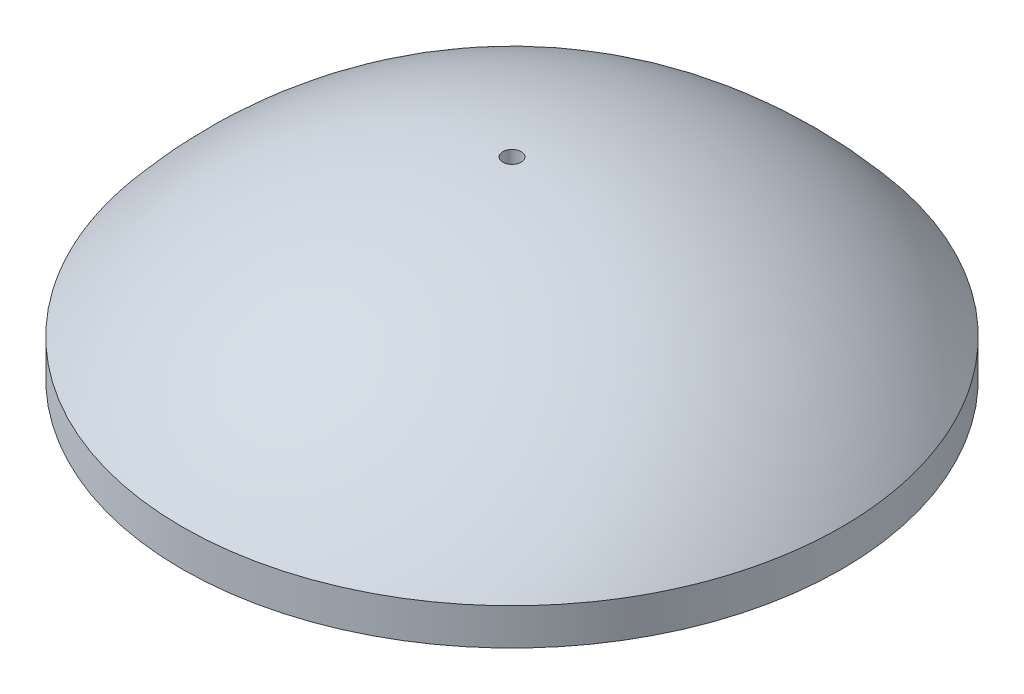
ISO-10303-21;
HEADER;
FILE_DESCRIPTION(('STEP AP214'),'2;1');
FILE_NAME('part.step','',(''),(''),'','','');
FILE_SCHEMA(('AUTOMOTIVE_DESIGN { 1 0 10303 214 1 1 1 1 }'));
ENDSEC;
DATA;
#1=APPLICATION_CONTEXT('core data for automotive mechanical design processes');
#2=APPLICATION_PROTOCOL_DEFINITION('international standard','automotive_design',2000,#1);
#3=PRODUCT_CONTEXT('',#1,'mechanical');
#4=PRODUCT('Part','Part','',(#3));
#5=PRODUCT_RELATED_PRODUCT_CATEGORY('part','',(#4));
#6=PRODUCT_DEFINITION_FORMATION('','',#4);
#7=PRODUCT_DEFINITION_CONTEXT('part definition',#1,'design');
#8=PRODUCT_DEFINITION('design','',#6,#7);
#9=PRODUCT_DEFINITION_SHAPE('','',#8);
#10=(LENGTH_UNIT() NAMED_UNIT(*) SI_UNIT(.MILLI.,.METRE.));
#11=(NAMED_UNIT(*) PLANE_ANGLE_UNIT() SI_UNIT($,.RADIAN.));
#12=(NAMED_UNIT(*) SI_UNIT($,.STERADIAN.) SOLID_ANGLE_UNIT());
#13=UNCERTAINTY_MEASURE_WITH_UNIT(LENGTH_MEASURE(1.E-05),#10,'distance_accuracy_value','');
#14=(GEOMETRIC_REPRESENTATION_CONTEXT(3) GLOBAL_UNCERTAINTY_ASSIGNED_CONTEXT((#13)) GLOBAL_UNIT_ASSIGNED_CONTEXT((#10,
#11,#12)) REPRESENTATION_CONTEXT('',''));
#15=CARTESIAN_POINT('',(0.,0.,0.));
#16=DIRECTION('',(0.,0.,1.));
#17=DIRECTION('',(1.,0.,0.));
#18=AXIS2_PLACEMENT_3D('',#15,#16,#17);
#19=CARTESIAN_POINT('',(0.,10.,-10.));
#20=DIRECTION('',(0.,1.,0.));
#21=DIRECTION('',(0.,0.,1.));
#22=AXIS2_PLACEMENT_3D('',#19,#20,#21);
#23=PLANE('',#22);
#24=CARTESIAN_POINT('',(0.,10.,0.));
#25=DIRECTION('',(0.,1.,0.));
#26=DIRECTION('',(0.,0.,-1.));
#27=AXIS2_PLACEMENT_3D('',#24,#25,#26);
#28=CIRCLE('',#27,19.);
#29=CARTESIAN_POINT('',(0.,10.,-19.));
#30=VERTEX_POINT('',#29);
#31=EDGE_CURVE('E54',#30,#30,#28,.F.);
#32=ORIENTED_EDGE('',*,*,#31,.T.);
#33=EDGE_LOOP('',(#32));
#34=FACE_BOUND('',#33,.T.);
#35=ADVANCED_FACE('F17',(#34),#23,.F.);
#36=CARTESIAN_POINT('',(0.,9.,0.));
#37=DIRECTION('',(0.,1.,0.));
#38=DIRECTION('',(0.,0.,1.));
#39=AXIS2_PLACEMENT_3D('',#36,#37,#38);
#40=TOROIDAL_SURFACE('',#39,19.,1.);
#41=CARTESIAN_POINT('',(0.,9.,0.));
#42=DIRECTION('',(0.,1.,0.));
#43=DIRECTION('',(0.,0.,1.));
#44=AXIS2_PLACEMENT_3D('',#41,#42,#43);
#45=CIRCLE('',#44,20.);
#46=CARTESIAN_POINT('',(0.,9.,20.));
#47=VERTEX_POINT('',#46);
#48=EDGE_CURVE('E48',#47,#47,#45,.F.);
#49=ORIENTED_EDGE('',*,*,#48,.T.);
#50=EDGE_LOOP('',(#49));
#51=FACE_BOUND('',#50,.T.);
#52=ORIENTED_EDGE('',*,*,#31,.F.);
#53=EDGE_LOOP('',(#52));
#54=FACE_BOUND('',#53,.T.);
#55=ADVANCED_FACE('F41',(#51,#54),#40,.F.);
#56=CARTESIAN_POINT('',(21.650635094611,7.99999999929923,-12.5));
#57=DIRECTION('',(0.,-1.,0.));
#58=DIRECTION('',(0.,0.,-1.));
#59=AXIS2_PLACEMENT_3D('',#56,#57,#58);
#60=CONICAL_SURFACE('',#59,1.22949999944477,1.02974425730668);
#61=CARTESIAN_POINT('',(21.6506350945451,8.73875813209679,-12.5));
#62=VERTEX_POINT('',#61);
#63=VERTEX_LOOP('',#62);
#64=FACE_BOUND('',#63,.T.);
#65=CARTESIAN_POINT('',(21.650635094611,8.,-12.5));
#66=DIRECTION('',(0.,-1.,0.));
#67=DIRECTION('',(0.,0.,-1.));
#68=AXIS2_PLACEMENT_3D('',#65,#66,#67);
#69=CIRCLE('',#68,1.2295);
#70=CARTESIAN_POINT('',(21.650635094611,8.,-13.7295));
#71=VERTEX_POINT('',#70);
#72=EDGE_CURVE('E45',#71,#71,#69,.T.);
#73=ORIENTED_EDGE('',*,*,#72,.T.);
#74=EDGE_LOOP('',(#73));
#75=FACE_BOUND('',#74,.T.);
#76=ADVANCED_FACE('F37',(#64,#75),#60,.F.);
#77=CARTESIAN_POINT('',(-21.650635094611,7.99999999935608,-12.5));
#78=DIRECTION('',(0.,-1.,0.));
#79=DIRECTION('',(0.,0.,-1.));
#80=AXIS2_PLACEMENT_3D('',#77,#78,#79);
#81=CONICAL_SURFACE('',#80,1.22949999951961,1.02974425744878);
#82=CARTESIAN_POINT('',(-21.650635094602,8.73875813209679,-12.5));
#83=VERTEX_POINT('',#82);
#84=VERTEX_LOOP('',#83);
#85=FACE_BOUND('',#84,.T.);
#86=CARTESIAN_POINT('',(-21.650635094611,8.,-12.5));
#87=DIRECTION('',(0.,-1.,0.));
#88=DIRECTION('',(0.,0.,-1.));
#89=AXIS2_PLACEMENT_3D('',#86,#87,#88);
#90=CIRCLE('',#89,1.2295);
#91=CARTESIAN_POINT('',(-21.650635094611,8.,-13.7295));
#92=VERTEX_POINT('',#91);
#93=EDGE_CURVE('E47',#92,#92,#90,.T.);
#94=ORIENTED_EDGE('',*,*,#93,.T.);
#95=EDGE_LOOP('',(#94));
#96=FACE_BOUND('',#95,.T.);
#97=ADVANCED_FACE('F40',(#85,#96),#81,.F.);
#98=CARTESIAN_POINT('',(0.,7.99999999929923,25.));
#99=DIRECTION('',(0.,-1.,0.));
#100=DIRECTION('',(0.,0.,-1.));
#101=AXIS2_PLACEMENT_3D('',#98,#99,#100);
#102=CONICAL_SURFACE('',#101,1.22949999945376,1.02974425734711);
#103=CARTESIAN_POINT('',(-1.13686837721616E-10,8.73875813209679,25.));
#104=VERTEX_POINT('',#103);
#105=VERTEX_LOOP('',#104);
#106=FACE_BOUND('',#105,.T.);
#107=CARTESIAN_POINT('',(0.,8.,25.));
#108=DIRECTION('',(0.,-1.,0.));
#109=DIRECTION('',(0.,0.,-1.));
#110=AXIS2_PLACEMENT_3D('',#107,#108,#109);
#111=CIRCLE('',#110,1.2295);
#112=CARTESIAN_POINT('',(0.,8.,23.7705));
#113=VERTEX_POINT('',#112);
#114=EDGE_CURVE('E51',#113,#113,#111,.T.);
#115=ORIENTED_EDGE('',*,*,#114,.T.);
#116=EDGE_LOOP('',(#115));
#117=FACE_BOUND('',#116,.T.);
#118=ADVANCED_FACE('F145',(#106,#117),#102,.F.);
#119=CARTESIAN_POINT('',(0.,5.,0.));
#120=DIRECTION('',(0.,1.,0.));
#121=DIRECTION('',(0.,0.,1.));
#122=AXIS2_PLACEMENT_3D('',#119,#120,#121);
#123=CYLINDRICAL_SURFACE('',#122,20.);
#124=ORIENTED_EDGE('',*,*,#48,.F.);
#125=EDGE_LOOP('',(#124));
#126=FACE_BOUND('',#125,.T.);
#127=CARTESIAN_POINT('',(0.,0.,0.));
#128=DIRECTION('',(0.,1.,0.));
#129=DIRECTION('',(0.,0.,1.));
#130=AXIS2_PLACEMENT_3D('',#127,#128,#129);
#131=CIRCLE('',#130,20.);
#132=CARTESIAN_POINT('',(0.,0.,20.));
#133=VERTEX_POINT('',#132);
#134=EDGE_CURVE('E21',#133,#133,#131,.T.);
#135=ORIENTED_EDGE('',*,*,#134,.F.);
#136=EDGE_LOOP('',(#135));
#137=FACE_BOUND('',#136,.T.);
#138=ADVANCED_FACE('F142',(#126,#137),#123,.F.);
#139=CARTESIAN_POINT('',(21.650635094611,4.,-12.5));
#140=DIRECTION('',(0.,-1.,0.));
#141=DIRECTION('',(0.,0.,-1.));
#142=AXIS2_PLACEMENT_3D('',#139,#140,#141);
#143=CYLINDRICAL_SURFACE('',#142,1.2295);
#144=ORIENTED_EDGE('',*,*,#72,.F.);
#145=EDGE_LOOP('',(#144));
#146=FACE_BOUND('',#145,.T.);
#147=CARTESIAN_POINT('',(21.650635094611,0.,-12.5));
#148=DIRECTION('',(0.,-1.,0.));
#149=DIRECTION('',(0.,0.,-1.));
#150=AXIS2_PLACEMENT_3D('',#147,#148,#149);
#151=CIRCLE('',#150,1.2295);
#152=CARTESIAN_POINT('',(21.650635094611,0.,-13.7295));
#153=VERTEX_POINT('',#152);
#154=EDGE_CURVE('E95',#153,#153,#151,.F.);
#155=ORIENTED_EDGE('',*,*,#154,.F.);
#156=EDGE_LOOP('',(#155));
#157=FACE_BOUND('',#156,.T.);
#158=ADVANCED_FACE('F138',(#146,#157),#143,.F.);
#159=CARTESIAN_POINT('',(-21.650635094611,4.,-12.5));
#160=DIRECTION('',(0.,-1.,0.));
#161=DIRECTION('',(0.,0.,-1.));
#162=AXIS2_PLACEMENT_3D('',#159,#160,#161);
#163=CYLINDRICAL_SURFACE('',#162,1.2295);
#164=ORIENTED_EDGE('',*,*,#93,.F.);
#165=EDGE_LOOP('',(#164));
#166=FACE_BOUND('',#165,.T.);
#167=CARTESIAN_POINT('',(-21.650635094611,0.,-12.5));
#168=DIRECTION('',(0.,-1.,0.));
#169=DIRECTION('',(0.,0.,-1.));
#170=AXIS2_PLACEMENT_3D('',#167,#168,#169);
#171=CIRCLE('',#170,1.2295);
#172=CARTESIAN_POINT('',(-21.650635094611,0.,-13.7295));
#173=VERTEX_POINT('',#172);
#174=EDGE_CURVE('E93',#173,#173,#171,.F.);
#175=ORIENTED_EDGE('',*,*,#174,.F.);
#176=EDGE_LOOP('',(#175));
#177=FACE_BOUND('',#176,.T.);
#178=ADVANCED_FACE('F134',(#166,#177),#163,.F.);
#179=CARTESIAN_POINT('',(0.,4.,25.));
#180=DIRECTION('',(0.,-1.,0.));
#181=DIRECTION('',(0.,0.,-1.));
#182=AXIS2_PLACEMENT_3D('',#179,#180,#181);
#183=CYLINDRICAL_SURFACE('',#182,1.2295);
#184=ORIENTED_EDGE('',*,*,#114,.F.);
#185=EDGE_LOOP('',(#184));
#186=FACE_BOUND('',#185,.T.);
#187=CARTESIAN_POINT('',(0.,0.,25.));
#188=DIRECTION('',(0.,-1.,0.));
#189=DIRECTION('',(0.,0.,-1.));
#190=AXIS2_PLACEMENT_3D('',#187,#188,#189);
#191=CIRCLE('',#190,1.2295);
#192=CARTESIAN_POINT('',(0.,0.,23.7705));
#193=VERTEX_POINT('',#192);
#194=EDGE_CURVE('E90',#193,#193,#191,.F.);
#195=ORIENTED_EDGE('',*,*,#194,.F.);
#196=EDGE_LOOP('',(#195));
#197=FACE_BOUND('',#196,.T.);
#198=ADVANCED_FACE('F130',(#186,#197),#183,.F.);
#199=CARTESIAN_POINT('',(0.,16.,-0.499999999999999));
#200=DIRECTION('',(0.,-1.,0.));
#201=DIRECTION('',(0.,0.,-1.));
#202=AXIS2_PLACEMENT_3D('',#199,#200,#201);
#203=PLANE('',#202);
#204=CARTESIAN_POINT('',(0.,16.,0.));
#205=DIRECTION('',(0.,1.,0.));
#206=DIRECTION('',(0.,0.,1.));
#207=AXIS2_PLACEMENT_3D('',#204,#205,#206);
#208=CIRCLE('',#207,0.999999999999999);
#209=CARTESIAN_POINT('',(0.,16.,0.999999999999999));
#210=VERTEX_POINT('',#209);
#211=EDGE_CURVE('E87',#210,#210,#208,.T.);
#212=ORIENTED_EDGE('',*,*,#211,.T.);
#213=EDGE_LOOP('',(#212));
#214=FACE_BOUND('',#213,.T.);
#215=ADVANCED_FACE('F126',(#214),#203,.F.);
#216=CARTESIAN_POINT('',(18.,0.,0.));
#217=DIRECTION('',(0.,-1.,0.));
#218=DIRECTION('',(0.,0.,-1.));
#219=AXIS2_PLACEMENT_3D('',#216,#217,#218);
#220=PLANE('',#219);
#221=ORIENTED_EDGE('',*,*,#194,.T.);
#222=EDGE_LOOP('',(#221));
#223=FACE_BOUND('',#222,.T.);
#224=ORIENTED_EDGE('',*,*,#174,.T.);
#225=EDGE_LOOP('',(#224));
#226=FACE_BOUND('',#225,.T.);
#227=ORIENTED_EDGE('',*,*,#154,.T.);
#228=EDGE_LOOP('',(#227));
#229=FACE_BOUND('',#228,.T.);
#230=ORIENTED_EDGE('',*,*,#134,.T.);
#231=EDGE_LOOP('',(#230));
#232=FACE_BOUND('',#231,.T.);
#233=CARTESIAN_POINT('',(0.,0.,0.));
#234=DIRECTION('',(0.,-1.,0.));
#235=DIRECTION('',(0.,0.,-1.));
#236=AXIS2_PLACEMENT_3D('',#233,#234,#235);
#237=CIRCLE('',#236,36.);
#238=CARTESIAN_POINT('',(0.,0.,-36.));
#239=VERTEX_POINT('',#238);
#240=EDGE_CURVE('E84',#239,#239,#237,.F.);
#241=ORIENTED_EDGE('',*,*,#240,.F.);
#242=EDGE_LOOP('',(#241));
#243=FACE_BOUND('',#242,.T.);
#244=ADVANCED_FACE('F122',(#223,#226,#229,#232,#243),#220,.T.);
#245=CARTESIAN_POINT('',(0.,18.4946366069126,0.));
#246=DIRECTION('',(0.,1.,0.));
#247=DIRECTION('',(0.,0.,1.));
#248=AXIS2_PLACEMENT_3D('',#245,#246,#247);
#249=CYLINDRICAL_SURFACE('',#248,0.999999999999999);
#250=ORIENTED_EDGE('',*,*,#211,.F.);
#251=EDGE_LOOP('',(#250));
#252=FACE_BOUND('',#251,.T.);
#253=CARTESIAN_POINT('',(0.,20.9892732138252,0.));
#254=DIRECTION('',(0.,1.,0.));
#255=DIRECTION('',(0.,0.,1.));
#256=AXIS2_PLACEMENT_3D('',#253,#254,#255);
#257=CIRCLE('',#256,0.999999999999999);
#258=CARTESIAN_POINT('',(0.,20.9892732138252,0.999999999999999));
#259=VERTEX_POINT('',#258);
#260=EDGE_CURVE('E27',#259,#259,#257,.F.);
#261=ORIENTED_EDGE('',*,*,#260,.F.);
#262=EDGE_LOOP('',(#261));
#263=FACE_BOUND('',#262,.T.);
#264=ADVANCED_FACE('F118',(#252,#263),#249,.F.);
#265=CARTESIAN_POINT('',(0.,2.,0.));
#266=DIRECTION('',(0.,-1.,0.));
#267=DIRECTION('',(0.,0.,-1.));
#268=AXIS2_PLACEMENT_3D('',#265,#266,#267);
#269=CYLINDRICAL_SURFACE('',#268,36.);
#270=CARTESIAN_POINT('',(0.,4.,0.));
#271=DIRECTION('',(0.,-1.,0.));
#272=DIRECTION('',(0.,0.,-1.));
#273=AXIS2_PLACEMENT_3D('',#270,#271,#272);
#274=CIRCLE('',#273,36.);
#275=CARTESIAN_POINT('',(0.,4.,-36.));
#276=VERTEX_POINT('',#275);
#277=EDGE_CURVE('E11',#276,#276,#274,.F.);
#278=ORIENTED_EDGE('',*,*,#277,.F.);
#279=EDGE_LOOP('',(#278));
#280=FACE_BOUND('',#279,.T.);
#281=ORIENTED_EDGE('',*,*,#240,.T.);
#282=EDGE_LOOP('',(#281));
#283=FACE_BOUND('',#282,.T.);
#284=ADVANCED_FACE('F114',(#280,#283),#269,.T.);
#285=CARTESIAN_POINT('',(0.,-25.6176470588235,0.));
#286=DIRECTION('',(1.,0.,0.));
#287=DIRECTION('',(0.,1.,0.));
#288=AXIS2_PLACEMENT_3D('',#285,#286,#287);
#289=SPHERICAL_SURFACE('',#288,46.6176470588235);
#290=ORIENTED_EDGE('',*,*,#277,.T.);
#291=EDGE_LOOP('',(#290));
#292=FACE_BOUND('',#291,.T.);
#293=ORIENTED_EDGE('',*,*,#260,.T.);
#294=EDGE_LOOP('',(#293));
#295=FACE_BOUND('',#294,.T.);
#296=ADVANCED_FACE('F111',(#292,#295),#289,.T.);
#297=CLOSED_SHELL('',(#35,#55,#76,#97,#118,#138,#158,#178,#198,#215,#244,#264,#284,#296));
#298=MANIFOLD_SOLID_BREP('B1',#297);
#299=ADVANCED_BREP_SHAPE_REPRESENTATION('',(#18,#298),#14);
#300=SHAPE_DEFINITION_REPRESENTATION(#9,#299);
ENDSEC;
END-ISO-10303-21;
